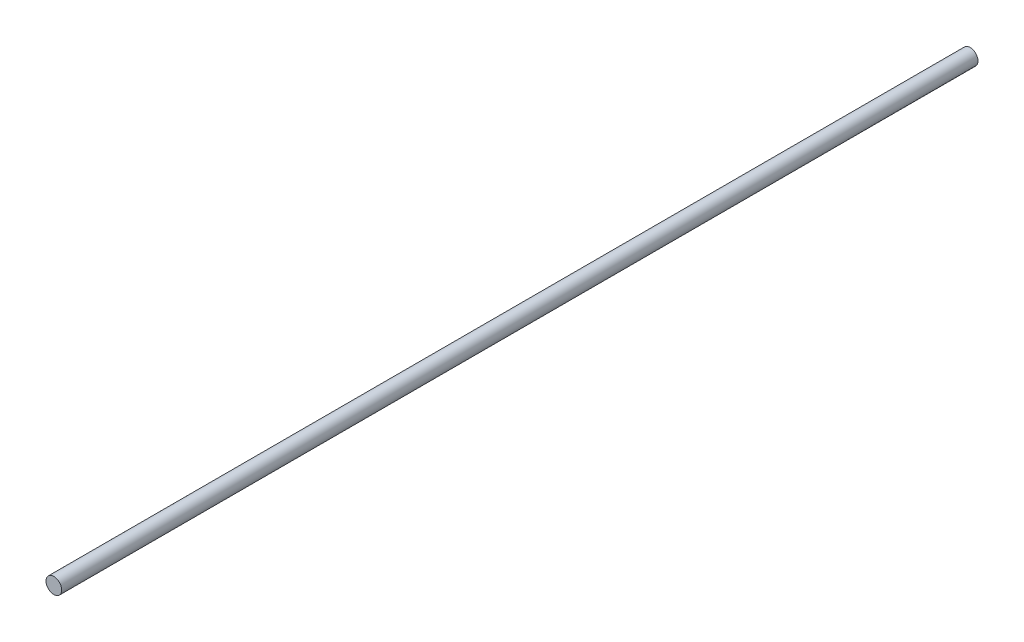
ISO-10303-21;
HEADER;
FILE_DESCRIPTION(('STEP AP214'),'2;1');
FILE_NAME('part.step','',(''),(''),'','','');
FILE_SCHEMA(('AUTOMOTIVE_DESIGN { 1 0 10303 214 1 1 1 1 }'));
ENDSEC;
DATA;
#1=APPLICATION_CONTEXT('core data for automotive mechanical design processes');
#2=APPLICATION_PROTOCOL_DEFINITION('international standard','automotive_design',2000,#1);
#3=PRODUCT_CONTEXT('',#1,'mechanical');
#4=PRODUCT('Part','Part','',(#3));
#5=PRODUCT_RELATED_PRODUCT_CATEGORY('part','',(#4));
#6=PRODUCT_DEFINITION_FORMATION('','',#4);
#7=PRODUCT_DEFINITION_CONTEXT('part definition',#1,'design');
#8=PRODUCT_DEFINITION('design','',#6,#7);
#9=PRODUCT_DEFINITION_SHAPE('','',#8);
#10=(LENGTH_UNIT() NAMED_UNIT(*) SI_UNIT(.MILLI.,.METRE.));
#11=(NAMED_UNIT(*) PLANE_ANGLE_UNIT() SI_UNIT($,.RADIAN.));
#12=(NAMED_UNIT(*) SI_UNIT($,.STERADIAN.) SOLID_ANGLE_UNIT());
#13=UNCERTAINTY_MEASURE_WITH_UNIT(LENGTH_MEASURE(1.E-05),#10,'distance_accuracy_value','');
#14=(GEOMETRIC_REPRESENTATION_CONTEXT(3) GLOBAL_UNCERTAINTY_ASSIGNED_CONTEXT((#13)) GLOBAL_UNIT_ASSIGNED_CONTEXT((#10,
#11,#12)) REPRESENTATION_CONTEXT('',''));
#15=CARTESIAN_POINT('',(0.,0.,0.));
#16=DIRECTION('',(0.,0.,1.));
#17=DIRECTION('',(1.,0.,0.));
#18=AXIS2_PLACEMENT_3D('',#15,#16,#17);
#19=CARTESIAN_POINT('',(0.,0.,350.));
#20=DIRECTION('',(0.,0.,-1.));
#21=DIRECTION('',(-1.,0.,0.));
#22=AXIS2_PLACEMENT_3D('',#19,#20,#21);
#23=CYLINDRICAL_SURFACE('',#22,3.);
#24=CARTESIAN_POINT('',(0.,0.,350.));
#25=DIRECTION('',(0.,0.,1.));
#26=DIRECTION('',(1.,0.,0.));
#27=AXIS2_PLACEMENT_3D('',#24,#25,#26);
#28=CIRCLE('',#27,3.);
#29=CARTESIAN_POINT('',(3.,0.,350.));
#30=VERTEX_POINT('',#29);
#31=EDGE_CURVE('E10',#30,#30,#28,.T.);
#32=ORIENTED_EDGE('',*,*,#31,.F.);
#33=EDGE_LOOP('',(#32));
#34=FACE_BOUND('',#33,.T.);
#35=CARTESIAN_POINT('',(0.,0.,0.));
#36=DIRECTION('',(0.,0.,1.));
#37=DIRECTION('',(1.,0.,0.));
#38=AXIS2_PLACEMENT_3D('',#35,#36,#37);
#39=CIRCLE('',#38,3.);
#40=CARTESIAN_POINT('',(3.,0.,0.));
#41=VERTEX_POINT('',#40);
#42=EDGE_CURVE('E34',#41,#41,#39,.T.);
#43=ORIENTED_EDGE('',*,*,#42,.T.);
#44=EDGE_LOOP('',(#43));
#45=FACE_BOUND('',#44,.T.);
#46=ADVANCED_FACE('F31',(#34,#45),#23,.T.);
#47=CARTESIAN_POINT('',(0.,0.,350.));
#48=DIRECTION('',(0.,0.,1.));
#49=DIRECTION('',(1.,0.,0.));
#50=AXIS2_PLACEMENT_3D('',#47,#48,#49);
#51=PLANE('',#50);
#52=ORIENTED_EDGE('',*,*,#31,.T.);
#53=EDGE_LOOP('',(#52));
#54=FACE_BOUND('',#53,.T.);
#55=ADVANCED_FACE('F46',(#54),#51,.T.);
#56=CARTESIAN_POINT('',(0.,0.,0.));
#57=DIRECTION('',(0.,0.,1.));
#58=DIRECTION('',(1.,0.,0.));
#59=AXIS2_PLACEMENT_3D('',#56,#57,#58);
#60=PLANE('',#59);
#61=ORIENTED_EDGE('',*,*,#42,.F.);
#62=EDGE_LOOP('',(#61));
#63=FACE_BOUND('',#62,.T.);
#64=ADVANCED_FACE('F44',(#63),#60,.F.);
#65=CLOSED_SHELL('',(#46,#55,#64));
#66=MANIFOLD_SOLID_BREP('B2',#65);
#67=ADVANCED_BREP_SHAPE_REPRESENTATION('',(#18,#66),#14);
#68=SHAPE_DEFINITION_REPRESENTATION(#9,#67);
ENDSEC;
END-ISO-10303-21;
